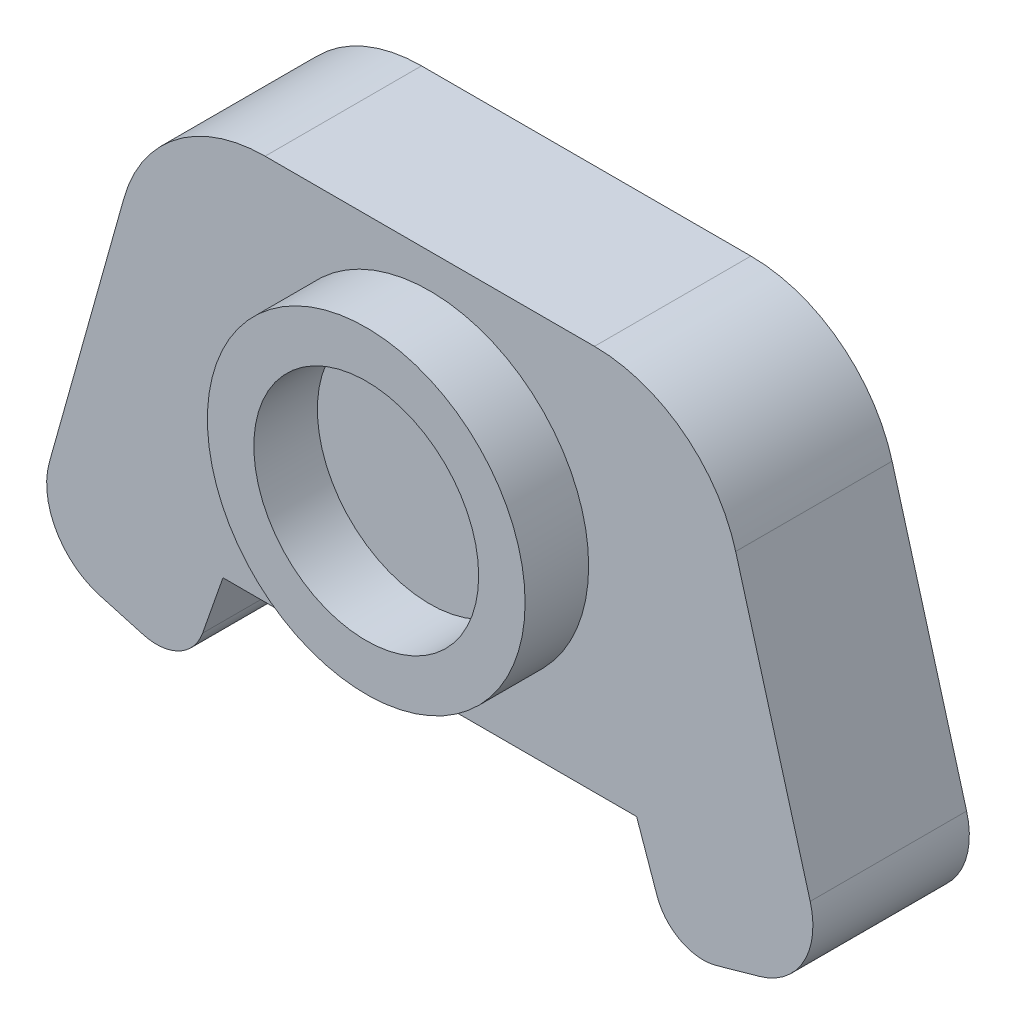
ISO-10303-21;
HEADER;
FILE_DESCRIPTION(('STEP AP214'),'2;1');
FILE_NAME('part.step','',(''),(''),'','','');
FILE_SCHEMA(('AUTOMOTIVE_DESIGN { 1 0 10303 214 1 1 1 1 }'));
ENDSEC;
DATA;
#1=APPLICATION_CONTEXT('core data for automotive mechanical design processes');
#2=APPLICATION_PROTOCOL_DEFINITION('international standard','automotive_design',2000,#1);
#3=PRODUCT_CONTEXT('',#1,'mechanical');
#4=PRODUCT('Part','Part','',(#3));
#5=PRODUCT_RELATED_PRODUCT_CATEGORY('part','',(#4));
#6=PRODUCT_DEFINITION_FORMATION('','',#4);
#7=PRODUCT_DEFINITION_CONTEXT('part definition',#1,'design');
#8=PRODUCT_DEFINITION('design','',#6,#7);
#9=PRODUCT_DEFINITION_SHAPE('','',#8);
#10=(LENGTH_UNIT() NAMED_UNIT(*) SI_UNIT(.MILLI.,.METRE.));
#11=(NAMED_UNIT(*) PLANE_ANGLE_UNIT() SI_UNIT($,.RADIAN.));
#12=(NAMED_UNIT(*) SI_UNIT($,.STERADIAN.) SOLID_ANGLE_UNIT());
#13=UNCERTAINTY_MEASURE_WITH_UNIT(LENGTH_MEASURE(1.E-05),#10,'distance_accuracy_value','');
#14=(GEOMETRIC_REPRESENTATION_CONTEXT(3) GLOBAL_UNCERTAINTY_ASSIGNED_CONTEXT((#13)) GLOBAL_UNIT_ASSIGNED_CONTEXT((#10,
#11,#12)) REPRESENTATION_CONTEXT('',''));
#15=CARTESIAN_POINT('',(0.,0.,0.));
#16=DIRECTION('',(0.,0.,1.));
#17=DIRECTION('',(1.,0.,0.));
#18=AXIS2_PLACEMENT_3D('',#15,#16,#17);
#19=CARTESIAN_POINT('',(5.64375,3.51875,3.2));
#20=DIRECTION('',(-0.96286727170263,-0.269975215684577,0.));
#21=DIRECTION('',(0.269975215684577,-0.96286727170263,0.));
#22=AXIS2_PLACEMENT_3D('',#19,#20,#21);
#23=PLANE('',#22);
#24=DIRECTION('',(-0.269975215684577,0.96286727170263,0.));
#25=VECTOR('',#24,1.);
#26=CARTESIAN_POINT('',(5.64375,3.51875,3.2));
#27=LINE('',#26,#25);
#28=CARTESIAN_POINT('',(7.78219639085738,-4.10802432010218,3.2));
#29=VERTEX_POINT('',#28);
#30=CARTESIAN_POINT('',(6.25781780890621,1.32867564705373,3.2));
#31=VERTEX_POINT('',#30);
#32=EDGE_CURVE('E190',#29,#31,#27,.T.);
#33=ORIENTED_EDGE('',*,*,#32,.F.);
#34=DIRECTION('',(0.,0.,-1.));
#35=VECTOR('',#34,1.);
#36=CARTESIAN_POINT('',(7.78219639085738,-4.10802432010218,3.2));
#37=LINE('',#36,#35);
#38=CARTESIAN_POINT('',(7.78219639085738,-4.10802432010218,0.));
#39=VERTEX_POINT('',#38);
#40=EDGE_CURVE('E226',#29,#39,#37,.T.);
#41=ORIENTED_EDGE('',*,*,#40,.T.);
#42=DIRECTION('',(-0.269975215684577,0.96286727170263,0.));
#43=VECTOR('',#42,1.);
#44=CARTESIAN_POINT('',(5.64375,3.51875,0.));
#45=LINE('',#44,#43);
#46=CARTESIAN_POINT('',(6.25781780890621,1.32867564705373,0.));
#47=VERTEX_POINT('',#46);
#48=EDGE_CURVE('E171',#39,#47,#45,.T.);
#49=ORIENTED_EDGE('',*,*,#48,.T.);
#50=DIRECTION('',(0.,0.,-1.));
#51=VECTOR('',#50,1.);
#52=CARTESIAN_POINT('',(6.25781780890621,1.32867564705373,3.2));
#53=LINE('',#52,#51);
#54=EDGE_CURVE('E209',#47,#31,#53,.F.);
#55=ORIENTED_EDGE('',*,*,#54,.T.);
#56=EDGE_LOOP('',(#33,#41,#49,#55));
#57=FACE_BOUND('',#56,.T.);
#58=ADVANCED_FACE('F39',(#57),#23,.F.);
#59=CARTESIAN_POINT('',(-5.64375,3.51875,3.2));
#60=DIRECTION('',(0.,-1.,0.));
#61=DIRECTION('',(0.,0.,-1.));
#62=AXIS2_PLACEMENT_3D('',#59,#60,#61);
#63=PLANE('',#62);
#64=DIRECTION('',(-1.,0.,0.));
#65=VECTOR('',#64,1.);
#66=CARTESIAN_POINT('',(-5.64375,3.51875,0.));
#67=LINE('',#66,#65);
#68=CARTESIAN_POINT('',(3.36921599379832,3.51875,0.));
#69=VERTEX_POINT('',#68);
#70=CARTESIAN_POINT('',(-3.36921599379832,3.51875,0.));
#71=VERTEX_POINT('',#70);
#72=EDGE_CURVE('E173',#69,#71,#67,.T.);
#73=ORIENTED_EDGE('',*,*,#72,.T.);
#74=DIRECTION('',(0.,0.,-1.));
#75=VECTOR('',#74,1.);
#76=CARTESIAN_POINT('',(-3.36921599379832,3.51875,3.2));
#77=LINE('',#76,#75);
#78=CARTESIAN_POINT('',(-3.36921599379832,3.51875,3.2));
#79=VERTEX_POINT('',#78);
#80=EDGE_CURVE('E203',#71,#79,#77,.F.);
#81=ORIENTED_EDGE('',*,*,#80,.T.);
#82=DIRECTION('',(-1.,0.,0.));
#83=VECTOR('',#82,1.);
#84=CARTESIAN_POINT('',(-5.64375,3.51875,3.2));
#85=LINE('',#84,#83);
#86=CARTESIAN_POINT('',(3.36921599379832,3.51875,3.2));
#87=VERTEX_POINT('',#86);
#88=EDGE_CURVE('E260',#87,#79,#85,.T.);
#89=ORIENTED_EDGE('',*,*,#88,.F.);
#90=DIRECTION('',(0.,0.,-1.));
#91=VECTOR('',#90,1.);
#92=CARTESIAN_POINT('',(3.36921599379832,3.51875,3.2));
#93=LINE('',#92,#91);
#94=EDGE_CURVE('E200',#87,#69,#93,.T.);
#95=ORIENTED_EDGE('',*,*,#94,.T.);
#96=EDGE_LOOP('',(#73,#81,#89,#95));
#97=FACE_BOUND('',#96,.T.);
#98=ADVANCED_FACE('F283',(#97),#63,.F.);
#99=CARTESIAN_POINT('',(-5.64375,3.51875,3.2));
#100=DIRECTION('',(0.96286727170263,-0.269975215684577,0.));
#101=DIRECTION('',(0.269975215684577,0.96286727170263,0.));
#102=AXIS2_PLACEMENT_3D('',#99,#100,#101);
#103=PLANE('',#102);
#104=DIRECTION('',(-0.269975215684577,-0.96286727170263,0.));
#105=VECTOR('',#104,1.);
#106=CARTESIAN_POINT('',(-5.64375,3.51875,0.));
#107=LINE('',#106,#105);
#108=CARTESIAN_POINT('',(-6.25781780890621,1.32867564705373,0.));
#109=VERTEX_POINT('',#108);
#110=CARTESIAN_POINT('',(-7.78219639085738,-4.10802432010218,0.));
#111=VERTEX_POINT('',#110);
#112=EDGE_CURVE('E177',#109,#111,#107,.T.);
#113=ORIENTED_EDGE('',*,*,#112,.T.);
#114=DIRECTION('',(0.,0.,-1.));
#115=VECTOR('',#114,1.);
#116=CARTESIAN_POINT('',(-7.78219639085738,-4.10802432010218,3.2));
#117=LINE('',#116,#115);
#118=CARTESIAN_POINT('',(-7.78219639085738,-4.10802432010218,3.2));
#119=VERTEX_POINT('',#118);
#120=EDGE_CURVE('E220',#111,#119,#117,.F.);
#121=ORIENTED_EDGE('',*,*,#120,.T.);
#122=DIRECTION('',(-0.269975215684577,-0.96286727170263,0.));
#123=VECTOR('',#122,1.);
#124=CARTESIAN_POINT('',(-5.64375,3.51875,3.2));
#125=LINE('',#124,#123);
#126=CARTESIAN_POINT('',(-6.25781780890621,1.32867564705373,3.2));
#127=VERTEX_POINT('',#126);
#128=EDGE_CURVE('E263',#127,#119,#125,.T.);
#129=ORIENTED_EDGE('',*,*,#128,.F.);
#130=DIRECTION('',(0.,0.,-1.));
#131=VECTOR('',#130,1.);
#132=CARTESIAN_POINT('',(-6.25781780890621,1.32867564705373,3.2));
#133=LINE('',#132,#131);
#134=EDGE_CURVE('E192',#127,#109,#133,.T.);
#135=ORIENTED_EDGE('',*,*,#134,.T.);
#136=EDGE_LOOP('',(#113,#121,#129,#135));
#137=FACE_BOUND('',#136,.T.);
#138=ADVANCED_FACE('F290',(#137),#103,.F.);
#139=CARTESIAN_POINT('',(-8.18715921438425,-5.55232522765612,3.2));
#140=DIRECTION('',(0.269975215684577,0.96286727170263,0.));
#141=DIRECTION('',(-0.96286727170263,0.269975215684577,0.));
#142=AXIS2_PLACEMENT_3D('',#139,#140,#141);
#143=PLANE('',#142);
#144=DIRECTION('',(0.96286727170263,-0.269975215684577,0.));
#145=VECTOR('',#144,1.);
#146=CARTESIAN_POINT('',(-8.18715921438425,-5.55232522765612,0.));
#147=LINE('',#146,#145);
#148=CARTESIAN_POINT('',(-6.7428583068303,-5.95728805118299,0.));
#149=VERTEX_POINT('',#148);
#150=CARTESIAN_POINT('',(-5.86182797900251,-6.20431727293581,0.));
#151=VERTEX_POINT('',#150);
#152=EDGE_CURVE('E180',#149,#151,#147,.T.);
#153=ORIENTED_EDGE('',*,*,#152,.T.);
#154=DIRECTION('',(0.,0.,-1.));
#155=VECTOR('',#154,1.);
#156=CARTESIAN_POINT('',(-5.86182797900251,-6.20431727293581,3.2));
#157=LINE('',#156,#155);
#158=CARTESIAN_POINT('',(-5.86182797900251,-6.20431727293581,3.2));
#159=VERTEX_POINT('',#158);
#160=EDGE_CURVE('E238',#151,#159,#157,.F.);
#161=ORIENTED_EDGE('',*,*,#160,.T.);
#162=DIRECTION('',(0.96286727170263,-0.269975215684577,0.));
#163=VECTOR('',#162,1.);
#164=CARTESIAN_POINT('',(-8.18715921438425,-5.55232522765612,3.2));
#165=LINE('',#164,#163);
#166=CARTESIAN_POINT('',(-6.7428583068303,-5.95728805118299,3.2));
#167=VERTEX_POINT('',#166);
#168=EDGE_CURVE('E150',#167,#159,#165,.T.);
#169=ORIENTED_EDGE('',*,*,#168,.F.);
#170=DIRECTION('',(0.,0.,-1.));
#171=VECTOR('',#170,1.);
#172=CARTESIAN_POINT('',(-6.7428583068303,-5.95728805118299,3.2));
#173=LINE('',#172,#171);
#174=EDGE_CURVE('E212',#167,#149,#173,.T.);
#175=ORIENTED_EDGE('',*,*,#174,.T.);
#176=EDGE_LOOP('',(#153,#161,#169,#175));
#177=FACE_BOUND('',#176,.T.);
#178=ADVANCED_FACE('F317',(#177),#143,.F.);
#179=CARTESIAN_POINT('',(-4.95810135294868,-6.45771023576582,3.2));
#180=DIRECTION('',(-0.94384556171174,0.330386978613036,0.));
#181=DIRECTION('',(-0.330386978613036,-0.94384556171174,0.));
#182=AXIS2_PLACEMENT_3D('',#179,#180,#181);
#183=PLANE('',#182);
#184=DIRECTION('',(0.330386978613036,0.94384556171174,0.));
#185=VECTOR('',#184,1.);
#186=CARTESIAN_POINT('',(-4.95810135294868,-6.45771023576582,3.2));
#187=LINE('',#186,#185);
#188=CARTESIAN_POINT('',(-4.64800720160619,-5.57183697984621,3.2));
#189=VERTEX_POINT('',#188);
#190=CARTESIAN_POINT('',(-4.23125,-4.38124999999999,3.2));
#191=VERTEX_POINT('',#190);
#192=EDGE_CURVE('E138',#189,#191,#187,.T.);
#193=ORIENTED_EDGE('',*,*,#192,.F.);
#194=DIRECTION('',(0.,0.,-1.));
#195=VECTOR('',#194,1.);
#196=CARTESIAN_POINT('',(-4.64800720160619,-5.57183697984621,3.2));
#197=LINE('',#196,#195);
#198=CARTESIAN_POINT('',(-4.64800720160619,-5.57183697984621,0.));
#199=VERTEX_POINT('',#198);
#200=EDGE_CURVE('E232',#189,#199,#197,.T.);
#201=ORIENTED_EDGE('',*,*,#200,.T.);
#202=DIRECTION('',(0.330386978613036,0.94384556171174,0.));
#203=VECTOR('',#202,1.);
#204=CARTESIAN_POINT('',(-4.95810135294868,-6.45771023576582,0.));
#205=LINE('',#204,#203);
#206=CARTESIAN_POINT('',(-4.23125,-4.38124999999999,0.));
#207=VERTEX_POINT('',#206);
#208=EDGE_CURVE('E156',#199,#207,#205,.T.);
#209=ORIENTED_EDGE('',*,*,#208,.T.);
#210=DIRECTION('',(0.,0.,-1.));
#211=VECTOR('',#210,1.);
#212=CARTESIAN_POINT('',(-4.23125,-4.38124999999999,3.2));
#213=LINE('',#212,#211);
#214=EDGE_CURVE('E153',#191,#207,#213,.T.);
#215=ORIENTED_EDGE('',*,*,#214,.F.);
#216=EDGE_LOOP('',(#193,#201,#209,#215));
#217=FACE_BOUND('',#216,.T.);
#218=ADVANCED_FACE('F154',(#217),#183,.F.);
#219=CARTESIAN_POINT('',(4.23125,-4.38125,3.2));
#220=DIRECTION('',(0.,1.,0.));
#221=DIRECTION('',(-1.,0.,0.));
#222=AXIS2_PLACEMENT_3D('',#219,#220,#221);
#223=PLANE('',#222);
#224=DIRECTION('',(1.,0.,0.));
#225=VECTOR('',#224,1.);
#226=CARTESIAN_POINT('',(4.23125,-4.38125,0.));
#227=LINE('',#226,#225);
#228=CARTESIAN_POINT('',(4.23125,-4.38125,0.));
#229=VERTEX_POINT('',#228);
#230=EDGE_CURVE('E184',#207,#229,#227,.T.);
#231=ORIENTED_EDGE('',*,*,#230,.T.);
#232=DIRECTION('',(0.,0.,-1.));
#233=VECTOR('',#232,1.);
#234=CARTESIAN_POINT('',(4.23125,-4.38125,3.2));
#235=LINE('',#234,#233);
#236=CARTESIAN_POINT('',(4.23125,-4.38125,3.2));
#237=VERTEX_POINT('',#236);
#238=EDGE_CURVE('E160',#237,#229,#235,.T.);
#239=ORIENTED_EDGE('',*,*,#238,.F.);
#240=DIRECTION('',(1.,0.,0.));
#241=VECTOR('',#240,1.);
#242=CARTESIAN_POINT('',(4.23125,-4.38125,3.2));
#243=LINE('',#242,#241);
#244=EDGE_CURVE('E143',#191,#237,#243,.T.);
#245=ORIENTED_EDGE('',*,*,#244,.F.);
#246=ORIENTED_EDGE('',*,*,#214,.T.);
#247=EDGE_LOOP('',(#231,#239,#245,#246));
#248=FACE_BOUND('',#247,.T.);
#249=ADVANCED_FACE('F162',(#248),#223,.F.);
#250=CARTESIAN_POINT('',(4.95810135294868,-6.45771023576583,3.2));
#251=DIRECTION('',(0.94384556171174,0.330386978613036,0.));
#252=DIRECTION('',(-0.330386978613036,0.94384556171174,0.));
#253=AXIS2_PLACEMENT_3D('',#250,#251,#252);
#254=PLANE('',#253);
#255=DIRECTION('',(0.330386978613036,-0.94384556171174,0.));
#256=VECTOR('',#255,1.);
#257=CARTESIAN_POINT('',(4.95810135294868,-6.45771023576583,0.));
#258=LINE('',#257,#256);
#259=CARTESIAN_POINT('',(4.64800720160619,-5.57183697984622,0.));
#260=VERTEX_POINT('',#259);
#261=EDGE_CURVE('E186',#229,#260,#258,.T.);
#262=ORIENTED_EDGE('',*,*,#261,.T.);
#263=DIRECTION('',(0.,0.,-1.));
#264=VECTOR('',#263,1.);
#265=CARTESIAN_POINT('',(4.64800720160619,-5.57183697984622,3.2));
#266=LINE('',#265,#264);
#267=CARTESIAN_POINT('',(4.64800720160619,-5.57183697984622,3.2));
#268=VERTEX_POINT('',#267);
#269=EDGE_CURVE('E11',#260,#268,#266,.F.);
#270=ORIENTED_EDGE('',*,*,#269,.T.);
#271=DIRECTION('',(0.330386978613036,-0.94384556171174,0.));
#272=VECTOR('',#271,1.);
#273=CARTESIAN_POINT('',(4.95810135294868,-6.45771023576583,3.2));
#274=LINE('',#273,#272);
#275=EDGE_CURVE('E164',#237,#268,#274,.T.);
#276=ORIENTED_EDGE('',*,*,#275,.F.);
#277=ORIENTED_EDGE('',*,*,#238,.T.);
#278=EDGE_LOOP('',(#262,#270,#276,#277));
#279=FACE_BOUND('',#278,.T.);
#280=ADVANCED_FACE('F277',(#279),#254,.F.);
#281=CARTESIAN_POINT('',(8.18715921438425,-5.55232522765613,3.2));
#282=DIRECTION('',(-0.269975215684577,0.96286727170263,0.));
#283=DIRECTION('',(-0.96286727170263,-0.269975215684577,0.));
#284=AXIS2_PLACEMENT_3D('',#281,#282,#283);
#285=PLANE('',#284);
#286=DIRECTION('',(0.96286727170263,0.269975215684577,0.));
#287=VECTOR('',#286,1.);
#288=CARTESIAN_POINT('',(8.18715921438425,-5.55232522765613,3.2));
#289=LINE('',#288,#287);
#290=CARTESIAN_POINT('',(5.86182797900251,-6.20431727293581,3.2));
#291=VERTEX_POINT('',#290);
#292=CARTESIAN_POINT('',(6.74285830683031,-5.95728805118299,3.2));
#293=VERTEX_POINT('',#292);
#294=EDGE_CURVE('E166',#291,#293,#289,.T.);
#295=ORIENTED_EDGE('',*,*,#294,.F.);
#296=DIRECTION('',(0.,0.,-1.));
#297=VECTOR('',#296,1.);
#298=CARTESIAN_POINT('',(5.86182797900251,-6.20431727293581,3.2));
#299=LINE('',#298,#297);
#300=CARTESIAN_POINT('',(5.86182797900251,-6.20431727293581,0.));
#301=VERTEX_POINT('',#300);
#302=EDGE_CURVE('E47',#291,#301,#299,.T.);
#303=ORIENTED_EDGE('',*,*,#302,.T.);
#304=DIRECTION('',(0.96286727170263,0.269975215684577,0.));
#305=VECTOR('',#304,1.);
#306=CARTESIAN_POINT('',(8.18715921438425,-5.55232522765613,0.));
#307=LINE('',#306,#305);
#308=CARTESIAN_POINT('',(6.74285830683031,-5.95728805118299,0.));
#309=VERTEX_POINT('',#308);
#310=EDGE_CURVE('E188',#301,#309,#307,.T.);
#311=ORIENTED_EDGE('',*,*,#310,.T.);
#312=DIRECTION('',(0.,0.,-1.));
#313=VECTOR('',#312,1.);
#314=CARTESIAN_POINT('',(6.74285830683031,-5.95728805118299,3.2));
#315=LINE('',#314,#313);
#316=EDGE_CURVE('E229',#309,#293,#315,.F.);
#317=ORIENTED_EDGE('',*,*,#316,.T.);
#318=EDGE_LOOP('',(#295,#303,#311,#317));
#319=FACE_BOUND('',#318,.T.);
#320=ADVANCED_FACE('F245',(#319),#285,.F.);
#321=CARTESIAN_POINT('',(0.,0.,3.2));
#322=DIRECTION('',(0.,0.,-1.));
#323=DIRECTION('',(-1.,0.,0.));
#324=AXIS2_PLACEMENT_3D('',#321,#322,#323);
#325=PLANE('',#324);
#326=CARTESIAN_POINT('',(0.,-0.431249999999998,3.2));
#327=DIRECTION('',(0.,0.,1.));
#328=DIRECTION('',(1.,0.,0.));
#329=AXIS2_PLACEMENT_3D('',#326,#327,#328);
#330=CIRCLE('',#329,3.25);
#331=CARTESIAN_POINT('',(3.25,-0.431249999999998,3.2));
#332=VERTEX_POINT('',#331);
#333=EDGE_CURVE('E159',#332,#332,#330,.T.);
#334=ORIENTED_EDGE('',*,*,#333,.F.);
#335=EDGE_LOOP('',(#334));
#336=FACE_BOUND('',#335,.T.);
#337=ORIENTED_EDGE('',*,*,#168,.T.);
#338=CARTESIAN_POINT('',(-5.59185276331793,-5.24145000123318,3.2));
#339=DIRECTION('',(0.,0.,-1.));
#340=DIRECTION('',(-1.,0.,0.));
#341=AXIS2_PLACEMENT_3D('',#338,#339,#340);
#342=CIRCLE('',#341,1.);
#343=EDGE_CURVE('E146',#159,#189,#342,.F.);
#344=ORIENTED_EDGE('',*,*,#343,.T.);
#345=ORIENTED_EDGE('',*,*,#192,.T.);
#346=ORIENTED_EDGE('',*,*,#244,.T.);
#347=ORIENTED_EDGE('',*,*,#275,.T.);
#348=CARTESIAN_POINT('',(5.59185276331793,-5.24145000123318,3.2));
#349=DIRECTION('',(0.,0.,-1.));
#350=DIRECTION('',(-1.,0.,0.));
#351=AXIS2_PLACEMENT_3D('',#348,#349,#350);
#352=CIRCLE('',#351,1.);
#353=EDGE_CURVE('E54',#268,#291,#352,.F.);
#354=ORIENTED_EDGE('',*,*,#353,.T.);
#355=ORIENTED_EDGE('',*,*,#294,.T.);
#356=CARTESIAN_POINT('',(6.33789548330344,-4.51298714362905,3.2));
#357=DIRECTION('',(0.,0.,-1.));
#358=DIRECTION('',(-1.,0.,0.));
#359=AXIS2_PLACEMENT_3D('',#356,#357,#358);
#360=CIRCLE('',#359,1.5);
#361=EDGE_CURVE('E222',#293,#29,#360,.F.);
#362=ORIENTED_EDGE('',*,*,#361,.T.);
#363=ORIENTED_EDGE('',*,*,#32,.T.);
#364=CARTESIAN_POINT('',(3.36921599379832,0.518750000000001,3.2));
#365=DIRECTION('',(0.,0.,-1.));
#366=DIRECTION('',(-1.,0.,0.));
#367=AXIS2_PLACEMENT_3D('',#364,#365,#366);
#368=CIRCLE('',#367,3.);
#369=EDGE_CURVE('E205',#31,#87,#368,.F.);
#370=ORIENTED_EDGE('',*,*,#369,.T.);
#371=ORIENTED_EDGE('',*,*,#88,.T.);
#372=CARTESIAN_POINT('',(-3.36921599379832,0.518750000000001,3.2));
#373=DIRECTION('',(0.,0.,-1.));
#374=DIRECTION('',(-1.,0.,0.));
#375=AXIS2_PLACEMENT_3D('',#372,#373,#374);
#376=CIRCLE('',#375,3.);
#377=EDGE_CURVE('E207',#79,#127,#376,.F.);
#378=ORIENTED_EDGE('',*,*,#377,.T.);
#379=ORIENTED_EDGE('',*,*,#128,.T.);
#380=CARTESIAN_POINT('',(-6.33789548330344,-4.51298714362904,3.2));
#381=DIRECTION('',(0.,0.,-1.));
#382=DIRECTION('',(-1.,0.,0.));
#383=AXIS2_PLACEMENT_3D('',#380,#381,#382);
#384=CIRCLE('',#383,1.5);
#385=EDGE_CURVE('E224',#119,#167,#384,.F.);
#386=ORIENTED_EDGE('',*,*,#385,.T.);
#387=EDGE_LOOP('',(#337,#344,#345,#346,#347,#354,#355,#362,#363,#370,#371,#378,#379,#386));
#388=FACE_BOUND('',#387,.T.);
#389=ADVANCED_FACE('F141',(#336,#388),#325,.F.);
#390=CARTESIAN_POINT('',(0.,0.,0.));
#391=DIRECTION('',(0.,0.,-1.));
#392=DIRECTION('',(-1.,0.,0.));
#393=AXIS2_PLACEMENT_3D('',#390,#391,#392);
#394=PLANE('',#393);
#395=ORIENTED_EDGE('',*,*,#208,.F.);
#396=CARTESIAN_POINT('',(-5.59185276331793,-5.24145000123318,0.));
#397=DIRECTION('',(0.,0.,-1.));
#398=DIRECTION('',(-1.,0.,0.));
#399=AXIS2_PLACEMENT_3D('',#396,#397,#398);
#400=CIRCLE('',#399,1.);
#401=EDGE_CURVE('E236',#199,#151,#400,.T.);
#402=ORIENTED_EDGE('',*,*,#401,.T.);
#403=ORIENTED_EDGE('',*,*,#152,.F.);
#404=CARTESIAN_POINT('',(-6.33789548330344,-4.51298714362904,0.));
#405=DIRECTION('',(0.,0.,-1.));
#406=DIRECTION('',(-1.,0.,0.));
#407=AXIS2_PLACEMENT_3D('',#404,#405,#406);
#408=CIRCLE('',#407,1.5);
#409=EDGE_CURVE('E218',#149,#111,#408,.T.);
#410=ORIENTED_EDGE('',*,*,#409,.T.);
#411=ORIENTED_EDGE('',*,*,#112,.F.);
#412=CARTESIAN_POINT('',(-3.36921599379832,0.518750000000001,0.));
#413=DIRECTION('',(0.,0.,-1.));
#414=DIRECTION('',(-1.,0.,0.));
#415=AXIS2_PLACEMENT_3D('',#412,#413,#414);
#416=CIRCLE('',#415,3.);
#417=EDGE_CURVE('E198',#109,#71,#416,.T.);
#418=ORIENTED_EDGE('',*,*,#417,.T.);
#419=ORIENTED_EDGE('',*,*,#72,.F.);
#420=CARTESIAN_POINT('',(3.36921599379832,0.518750000000001,0.));
#421=DIRECTION('',(0.,0.,-1.));
#422=DIRECTION('',(-1.,0.,0.));
#423=AXIS2_PLACEMENT_3D('',#420,#421,#422);
#424=CIRCLE('',#423,3.);
#425=EDGE_CURVE('E195',#69,#47,#424,.T.);
#426=ORIENTED_EDGE('',*,*,#425,.T.);
#427=ORIENTED_EDGE('',*,*,#48,.F.);
#428=CARTESIAN_POINT('',(6.33789548330344,-4.51298714362905,0.));
#429=DIRECTION('',(0.,0.,-1.));
#430=DIRECTION('',(-1.,0.,0.));
#431=AXIS2_PLACEMENT_3D('',#428,#429,#430);
#432=CIRCLE('',#431,1.5);
#433=EDGE_CURVE('E215',#39,#309,#432,.T.);
#434=ORIENTED_EDGE('',*,*,#433,.T.);
#435=ORIENTED_EDGE('',*,*,#310,.F.);
#436=CARTESIAN_POINT('',(5.59185276331793,-5.24145000123318,0.));
#437=DIRECTION('',(0.,0.,-1.));
#438=DIRECTION('',(-1.,0.,0.));
#439=AXIS2_PLACEMENT_3D('',#436,#437,#438);
#440=CIRCLE('',#439,1.);
#441=EDGE_CURVE('E234',#301,#260,#440,.T.);
#442=ORIENTED_EDGE('',*,*,#441,.T.);
#443=ORIENTED_EDGE('',*,*,#261,.F.);
#444=ORIENTED_EDGE('',*,*,#230,.F.);
#445=EDGE_LOOP('',(#395,#402,#403,#410,#411,#418,#419,#426,#427,#434,#435,#442,#443,#444));
#446=FACE_BOUND('',#445,.T.);
#447=ADVANCED_FACE('F248',(#446),#394,.T.);
#448=CARTESIAN_POINT('',(0.,-0.431249999999998,4.5));
#449=DIRECTION('',(0.,0.,1.));
#450=DIRECTION('',(1.,0.,0.));
#451=AXIS2_PLACEMENT_3D('',#448,#449,#450);
#452=PLANE('',#451);
#453=CARTESIAN_POINT('',(0.,-0.431249999999998,4.5));
#454=DIRECTION('',(0.,0.,1.));
#455=DIRECTION('',(1.,0.,0.));
#456=AXIS2_PLACEMENT_3D('',#453,#454,#455);
#457=CIRCLE('',#456,3.25);
#458=CARTESIAN_POINT('',(3.25,-0.431249999999998,4.5));
#459=VERTEX_POINT('',#458);
#460=EDGE_CURVE('E174',#459,#459,#457,.T.);
#461=ORIENTED_EDGE('',*,*,#460,.T.);
#462=EDGE_LOOP('',(#461));
#463=FACE_BOUND('',#462,.T.);
#464=CARTESIAN_POINT('',(0.,-0.431249999999998,4.5));
#465=DIRECTION('',(0.,0.,1.));
#466=DIRECTION('',(1.,0.,0.));
#467=AXIS2_PLACEMENT_3D('',#464,#465,#466);
#468=CIRCLE('',#467,2.3);
#469=CARTESIAN_POINT('',(2.3,-0.431249999999998,4.5));
#470=VERTEX_POINT('',#469);
#471=EDGE_CURVE('E468',#470,#470,#468,.T.);
#472=ORIENTED_EDGE('',*,*,#471,.F.);
#473=EDGE_LOOP('',(#472));
#474=FACE_BOUND('',#473,.T.);
#475=ADVANCED_FACE('F358',(#463,#474),#452,.T.);
#476=CARTESIAN_POINT('',(0.,-0.431249999999998,4.5));
#477=DIRECTION('',(0.,0.,-1.));
#478=DIRECTION('',(-1.,0.,0.));
#479=AXIS2_PLACEMENT_3D('',#476,#477,#478);
#480=CYLINDRICAL_SURFACE('',#479,3.25);
#481=ORIENTED_EDGE('',*,*,#460,.F.);
#482=EDGE_LOOP('',(#481));
#483=FACE_BOUND('',#482,.T.);
#484=ORIENTED_EDGE('',*,*,#333,.T.);
#485=EDGE_LOOP('',(#484));
#486=FACE_BOUND('',#485,.T.);
#487=ADVANCED_FACE('F394',(#483,#486),#480,.T.);
#488=CARTESIAN_POINT('',(0.,-0.431249999999998,4.5));
#489=DIRECTION('',(0.,0.,-1.));
#490=DIRECTION('',(-1.,0.,0.));
#491=AXIS2_PLACEMENT_3D('',#488,#489,#490);
#492=CYLINDRICAL_SURFACE('',#491,2.3);
#493=ORIENTED_EDGE('',*,*,#471,.T.);
#494=EDGE_LOOP('',(#493));
#495=FACE_BOUND('',#494,.T.);
#496=CARTESIAN_POINT('',(0.,-0.431249999999998,3.2));
#497=DIRECTION('',(0.,0.,1.));
#498=DIRECTION('',(1.,0.,0.));
#499=AXIS2_PLACEMENT_3D('',#496,#497,#498);
#500=CIRCLE('',#499,2.3);
#501=CARTESIAN_POINT('',(2.3,-0.431249999999998,3.2));
#502=VERTEX_POINT('',#501);
#503=EDGE_CURVE('E466',#502,#502,#500,.T.);
#504=ORIENTED_EDGE('',*,*,#503,.F.);
#505=EDGE_LOOP('',(#504));
#506=FACE_BOUND('',#505,.T.);
#507=ADVANCED_FACE('F390',(#495,#506),#492,.F.);
#508=ORIENTED_EDGE('',*,*,#503,.T.);
#509=EDGE_LOOP('',(#508));
#510=FACE_BOUND('',#509,.T.);
#511=ADVANCED_FACE('F299',(#510),#325,.F.);
#512=CARTESIAN_POINT('',(-3.36921599379832,0.518750000000001,3.2));
#513=DIRECTION('',(0.,0.,-1.));
#514=DIRECTION('',(-1.,0.,0.));
#515=AXIS2_PLACEMENT_3D('',#512,#513,#514);
#516=CYLINDRICAL_SURFACE('',#515,3.);
#517=ORIENTED_EDGE('',*,*,#377,.F.);
#518=ORIENTED_EDGE('',*,*,#80,.F.);
#519=ORIENTED_EDGE('',*,*,#417,.F.);
#520=ORIENTED_EDGE('',*,*,#134,.F.);
#521=EDGE_LOOP('',(#517,#518,#519,#520));
#522=FACE_BOUND('',#521,.T.);
#523=ADVANCED_FACE('F295',(#522),#516,.T.);
#524=CARTESIAN_POINT('',(3.36921599379832,0.518750000000001,3.2));
#525=DIRECTION('',(0.,0.,-1.));
#526=DIRECTION('',(-1.,0.,0.));
#527=AXIS2_PLACEMENT_3D('',#524,#525,#526);
#528=CYLINDRICAL_SURFACE('',#527,3.);
#529=ORIENTED_EDGE('',*,*,#369,.F.);
#530=ORIENTED_EDGE('',*,*,#54,.F.);
#531=ORIENTED_EDGE('',*,*,#425,.F.);
#532=ORIENTED_EDGE('',*,*,#94,.F.);
#533=EDGE_LOOP('',(#529,#530,#531,#532));
#534=FACE_BOUND('',#533,.T.);
#535=ADVANCED_FACE('F298',(#534),#528,.T.);
#536=CARTESIAN_POINT('',(-6.33789548330344,-4.51298714362904,3.2));
#537=DIRECTION('',(0.,0.,-1.));
#538=DIRECTION('',(-1.,0.,0.));
#539=AXIS2_PLACEMENT_3D('',#536,#537,#538);
#540=CYLINDRICAL_SURFACE('',#539,1.5);
#541=ORIENTED_EDGE('',*,*,#385,.F.);
#542=ORIENTED_EDGE('',*,*,#120,.F.);
#543=ORIENTED_EDGE('',*,*,#409,.F.);
#544=ORIENTED_EDGE('',*,*,#174,.F.);
#545=EDGE_LOOP('',(#541,#542,#543,#544));
#546=FACE_BOUND('',#545,.T.);
#547=ADVANCED_FACE('F302',(#546),#540,.T.);
#548=CARTESIAN_POINT('',(6.33789548330344,-4.51298714362905,3.2));
#549=DIRECTION('',(0.,0.,-1.));
#550=DIRECTION('',(-1.,0.,0.));
#551=AXIS2_PLACEMENT_3D('',#548,#549,#550);
#552=CYLINDRICAL_SURFACE('',#551,1.5);
#553=ORIENTED_EDGE('',*,*,#361,.F.);
#554=ORIENTED_EDGE('',*,*,#316,.F.);
#555=ORIENTED_EDGE('',*,*,#433,.F.);
#556=ORIENTED_EDGE('',*,*,#40,.F.);
#557=EDGE_LOOP('',(#553,#554,#555,#556));
#558=FACE_BOUND('',#557,.T.);
#559=ADVANCED_FACE('F255',(#558),#552,.T.);
#560=CARTESIAN_POINT('',(-5.59185276331793,-5.24145000123318,3.2));
#561=DIRECTION('',(0.,0.,-1.));
#562=DIRECTION('',(-1.,0.,0.));
#563=AXIS2_PLACEMENT_3D('',#560,#561,#562);
#564=CYLINDRICAL_SURFACE('',#563,1.);
#565=ORIENTED_EDGE('',*,*,#343,.F.);
#566=ORIENTED_EDGE('',*,*,#160,.F.);
#567=ORIENTED_EDGE('',*,*,#401,.F.);
#568=ORIENTED_EDGE('',*,*,#200,.F.);
#569=EDGE_LOOP('',(#565,#566,#567,#568));
#570=FACE_BOUND('',#569,.T.);
#571=ADVANCED_FACE('F275',(#570),#564,.T.);
#572=CARTESIAN_POINT('',(5.59185276331793,-5.24145000123318,3.2));
#573=DIRECTION('',(0.,0.,-1.));
#574=DIRECTION('',(-1.,0.,0.));
#575=AXIS2_PLACEMENT_3D('',#572,#573,#574);
#576=CYLINDRICAL_SURFACE('',#575,1.);
#577=ORIENTED_EDGE('',*,*,#353,.F.);
#578=ORIENTED_EDGE('',*,*,#269,.F.);
#579=ORIENTED_EDGE('',*,*,#441,.F.);
#580=ORIENTED_EDGE('',*,*,#302,.F.);
#581=EDGE_LOOP('',(#577,#578,#579,#580));
#582=FACE_BOUND('',#581,.T.);
#583=ADVANCED_FACE('F41',(#582),#576,.T.);
#584=CLOSED_SHELL('',(#58,#98,#138,#178,#218,#249,#280,#320,#389,#447,#475,#487,#507,#511,#523,
#535,#547,#559,#571,#583));
#585=MANIFOLD_SOLID_BREP('B2',#584);
#586=ADVANCED_BREP_SHAPE_REPRESENTATION('',(#18,#585),#14);
#587=SHAPE_DEFINITION_REPRESENTATION(#9,#586);
ENDSEC;
END-ISO-10303-21;
